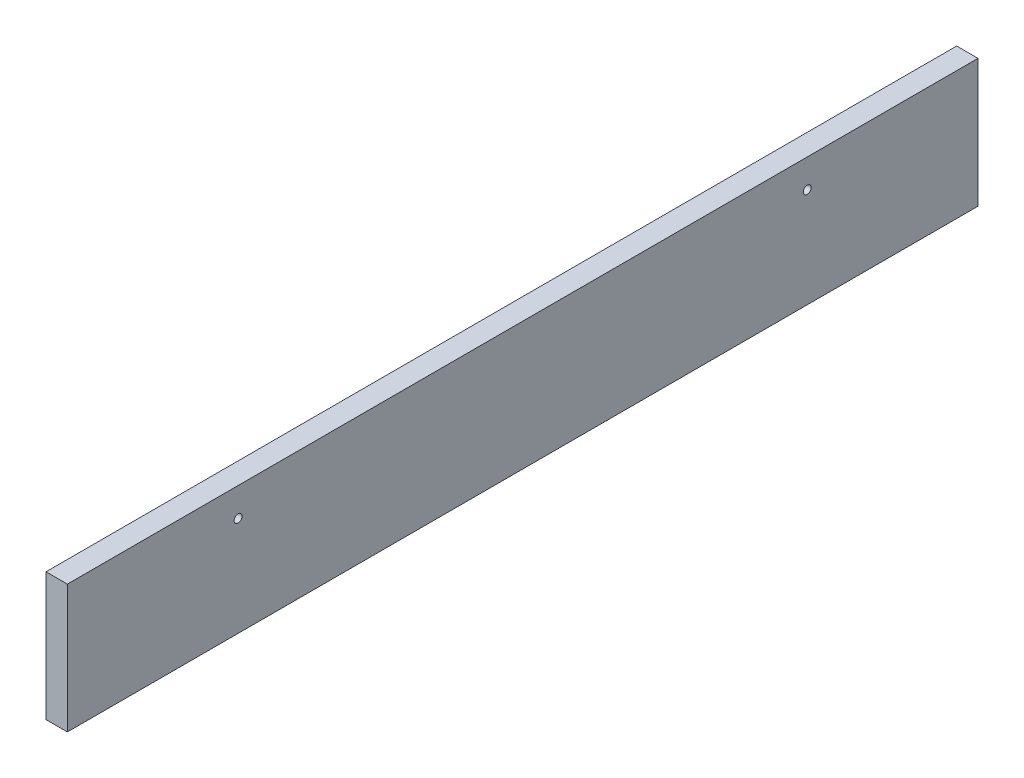
ISO-10303-21;
HEADER;
FILE_DESCRIPTION(('STEP AP214'),'2;1');
FILE_NAME('part.step','',(''),(''),'','','');
FILE_SCHEMA(('AUTOMOTIVE_DESIGN { 1 0 10303 214 1 1 1 1 }'));
ENDSEC;
DATA;
#1=APPLICATION_CONTEXT('core data for automotive mechanical design processes');
#2=APPLICATION_PROTOCOL_DEFINITION('international standard','automotive_design',2000,#1);
#3=PRODUCT_CONTEXT('',#1,'mechanical');
#4=PRODUCT('Part','Part','',(#3));
#5=PRODUCT_RELATED_PRODUCT_CATEGORY('part','',(#4));
#6=PRODUCT_DEFINITION_FORMATION('','',#4);
#7=PRODUCT_DEFINITION_CONTEXT('part definition',#1,'design');
#8=PRODUCT_DEFINITION('design','',#6,#7);
#9=PRODUCT_DEFINITION_SHAPE('','',#8);
#10=(LENGTH_UNIT() NAMED_UNIT(*) SI_UNIT(.MILLI.,.METRE.));
#11=(NAMED_UNIT(*) PLANE_ANGLE_UNIT() SI_UNIT($,.RADIAN.));
#12=(NAMED_UNIT(*) SI_UNIT($,.STERADIAN.) SOLID_ANGLE_UNIT());
#13=UNCERTAINTY_MEASURE_WITH_UNIT(LENGTH_MEASURE(1.E-05),#10,'distance_accuracy_value','');
#14=(GEOMETRIC_REPRESENTATION_CONTEXT(3) GLOBAL_UNCERTAINTY_ASSIGNED_CONTEXT((#13)) GLOBAL_UNIT_ASSIGNED_CONTEXT((#10,
#11,#12)) REPRESENTATION_CONTEXT('',''));
#15=CARTESIAN_POINT('',(0.,0.,0.));
#16=DIRECTION('',(0.,0.,1.));
#17=DIRECTION('',(1.,0.,0.));
#18=AXIS2_PLACEMENT_3D('',#15,#16,#17);
#19=CARTESIAN_POINT('',(-6.32852615853657,7.72454268292683,812.8));
#20=DIRECTION('',(1.,0.,0.));
#21=DIRECTION('',(0.,1.,0.));
#22=AXIS2_PLACEMENT_3D('',#19,#20,#21);
#23=PLANE('',#22);
#24=CARTESIAN_POINT('',(-6.32852615853657,-17.6754573170732,152.4));
#25=DIRECTION('',(-1.,0.,0.));
#26=DIRECTION('',(0.,-1.,0.));
#27=AXIS2_PLACEMENT_3D('',#24,#25,#26);
#28=CIRCLE('',#27,3.55600000000001);
#29=CARTESIAN_POINT('',(-6.32852615853657,-21.2314573170732,152.4));
#30=VERTEX_POINT('',#29);
#31=EDGE_CURVE('E140',#30,#30,#28,.T.);
#32=ORIENTED_EDGE('',*,*,#31,.F.);
#33=EDGE_LOOP('',(#32));
#34=FACE_BOUND('',#33,.T.);
#35=CARTESIAN_POINT('',(-6.32852615853657,-17.6754573170732,660.4));
#36=DIRECTION('',(-1.,0.,0.));
#37=DIRECTION('',(0.,-1.,0.));
#38=AXIS2_PLACEMENT_3D('',#35,#36,#37);
#39=CIRCLE('',#38,3.55599999999996);
#40=CARTESIAN_POINT('',(-6.32852615853657,-21.2314573170731,660.4));
#41=VERTEX_POINT('',#40);
#42=EDGE_CURVE('E132',#41,#41,#39,.T.);
#43=ORIENTED_EDGE('',*,*,#42,.F.);
#44=EDGE_LOOP('',(#43));
#45=FACE_BOUND('',#44,.T.);
#46=DIRECTION('',(0.,-1.,0.));
#47=VECTOR('',#46,1.);
#48=CARTESIAN_POINT('',(-6.32852615853657,7.72454268292683,0.));
#49=LINE('',#48,#47);
#50=CARTESIAN_POINT('',(-6.32852615853657,7.72454268292683,0.));
#51=VERTEX_POINT('',#50);
#52=CARTESIAN_POINT('',(-6.32852615853656,-106.575457317073,0.));
#53=VERTEX_POINT('',#52);
#54=EDGE_CURVE('E111',#51,#53,#49,.T.);
#55=ORIENTED_EDGE('',*,*,#54,.T.);
#56=DIRECTION('',(0.,0.,-1.));
#57=VECTOR('',#56,1.);
#58=CARTESIAN_POINT('',(-6.32852615853656,-106.575457317073,812.8));
#59=LINE('',#58,#57);
#60=CARTESIAN_POINT('',(-6.32852615853656,-106.575457317073,812.8));
#61=VERTEX_POINT('',#60);
#62=EDGE_CURVE('E11',#61,#53,#59,.T.);
#63=ORIENTED_EDGE('',*,*,#62,.F.);
#64=DIRECTION('',(0.,-1.,0.));
#65=VECTOR('',#64,1.);
#66=CARTESIAN_POINT('',(-6.32852615853657,7.72454268292683,812.8));
#67=LINE('',#66,#65);
#68=CARTESIAN_POINT('',(-6.32852615853657,7.72454268292683,812.8));
#69=VERTEX_POINT('',#68);
#70=EDGE_CURVE('E95',#69,#61,#67,.T.);
#71=ORIENTED_EDGE('',*,*,#70,.F.);
#72=DIRECTION('',(0.,0.,-1.));
#73=VECTOR('',#72,1.);
#74=CARTESIAN_POINT('',(-6.32852615853657,7.72454268292683,812.8));
#75=LINE('',#74,#73);
#76=EDGE_CURVE('E107',#69,#51,#75,.T.);
#77=ORIENTED_EDGE('',*,*,#76,.T.);
#78=EDGE_LOOP('',(#55,#63,#71,#77));
#79=FACE_BOUND('',#78,.T.);
#80=ADVANCED_FACE('F43',(#34,#45,#79),#23,.F.);
#81=CARTESIAN_POINT('',(-6.32852615853656,-106.575457317073,812.8));
#82=DIRECTION('',(0.,1.,0.));
#83=DIRECTION('',(0.,0.,1.));
#84=AXIS2_PLACEMENT_3D('',#81,#82,#83);
#85=PLANE('',#84);
#86=DIRECTION('',(1.,0.,0.));
#87=VECTOR('',#86,1.);
#88=CARTESIAN_POINT('',(-6.32852615853656,-106.575457317073,0.));
#89=LINE('',#88,#87);
#90=CARTESIAN_POINT('',(12.7214738414634,-106.575457317073,0.));
#91=VERTEX_POINT('',#90);
#92=EDGE_CURVE('E100',#53,#91,#89,.T.);
#93=ORIENTED_EDGE('',*,*,#92,.T.);
#94=DIRECTION('',(0.,0.,-1.));
#95=VECTOR('',#94,1.);
#96=CARTESIAN_POINT('',(12.7214738414634,-106.575457317073,812.8));
#97=LINE('',#96,#95);
#98=CARTESIAN_POINT('',(12.7214738414634,-106.575457317073,812.8));
#99=VERTEX_POINT('',#98);
#100=EDGE_CURVE('E52',#99,#91,#97,.T.);
#101=ORIENTED_EDGE('',*,*,#100,.F.);
#102=DIRECTION('',(1.,0.,0.));
#103=VECTOR('',#102,1.);
#104=CARTESIAN_POINT('',(-6.32852615853656,-106.575457317073,812.8));
#105=LINE('',#104,#103);
#106=EDGE_CURVE('E90',#61,#99,#105,.T.);
#107=ORIENTED_EDGE('',*,*,#106,.F.);
#108=ORIENTED_EDGE('',*,*,#62,.T.);
#109=EDGE_LOOP('',(#93,#101,#107,#108));
#110=FACE_BOUND('',#109,.T.);
#111=ADVANCED_FACE('F99',(#110),#85,.F.);
#112=CARTESIAN_POINT('',(12.7214738414634,7.72454268292683,812.8));
#113=DIRECTION('',(-1.,0.,0.));
#114=DIRECTION('',(0.,-1.,0.));
#115=AXIS2_PLACEMENT_3D('',#112,#113,#114);
#116=PLANE('',#115);
#117=CARTESIAN_POINT('',(12.7214738414635,-17.6754573170732,152.4));
#118=DIRECTION('',(-1.,0.,0.));
#119=DIRECTION('',(0.,-1.,0.));
#120=AXIS2_PLACEMENT_3D('',#117,#118,#119);
#121=CIRCLE('',#120,3.55600000000001);
#122=CARTESIAN_POINT('',(12.7214738414635,-21.2314573170732,152.4));
#123=VERTEX_POINT('',#122);
#124=EDGE_CURVE('E136',#123,#123,#121,.T.);
#125=ORIENTED_EDGE('',*,*,#124,.T.);
#126=EDGE_LOOP('',(#125));
#127=FACE_BOUND('',#126,.T.);
#128=CARTESIAN_POINT('',(12.7214738414634,-17.6754573170732,660.4));
#129=DIRECTION('',(-1.,0.,0.));
#130=DIRECTION('',(0.,-1.,0.));
#131=AXIS2_PLACEMENT_3D('',#128,#129,#130);
#132=CIRCLE('',#131,3.55599999999996);
#133=CARTESIAN_POINT('',(12.7214738414634,-21.2314573170731,660.4));
#134=VERTEX_POINT('',#133);
#135=EDGE_CURVE('E115',#134,#134,#132,.T.);
#136=ORIENTED_EDGE('',*,*,#135,.T.);
#137=EDGE_LOOP('',(#136));
#138=FACE_BOUND('',#137,.T.);
#139=DIRECTION('',(0.,1.,0.));
#140=VECTOR('',#139,1.);
#141=CARTESIAN_POINT('',(12.7214738414634,7.72454268292683,0.));
#142=LINE('',#141,#140);
#143=CARTESIAN_POINT('',(12.7214738414634,7.72454268292683,0.));
#144=VERTEX_POINT('',#143);
#145=EDGE_CURVE('E77',#91,#144,#142,.T.);
#146=ORIENTED_EDGE('',*,*,#145,.T.);
#147=DIRECTION('',(0.,0.,-1.));
#148=VECTOR('',#147,1.);
#149=CARTESIAN_POINT('',(12.7214738414634,7.72454268292683,812.8));
#150=LINE('',#149,#148);
#151=CARTESIAN_POINT('',(12.7214738414634,7.72454268292683,812.8));
#152=VERTEX_POINT('',#151);
#153=EDGE_CURVE('E102',#152,#144,#150,.T.);
#154=ORIENTED_EDGE('',*,*,#153,.F.);
#155=DIRECTION('',(0.,1.,0.));
#156=VECTOR('',#155,1.);
#157=CARTESIAN_POINT('',(12.7214738414634,7.72454268292683,812.8));
#158=LINE('',#157,#156);
#159=EDGE_CURVE('E93',#99,#152,#158,.T.);
#160=ORIENTED_EDGE('',*,*,#159,.F.);
#161=ORIENTED_EDGE('',*,*,#100,.T.);
#162=EDGE_LOOP('',(#146,#154,#160,#161));
#163=FACE_BOUND('',#162,.T.);
#164=ADVANCED_FACE('F103',(#127,#138,#163),#116,.F.);
#165=CARTESIAN_POINT('',(-6.32852615853657,7.72454268292683,812.8));
#166=DIRECTION('',(0.,-1.,0.));
#167=DIRECTION('',(0.,0.,-1.));
#168=AXIS2_PLACEMENT_3D('',#165,#166,#167);
#169=PLANE('',#168);
#170=DIRECTION('',(-1.,0.,0.));
#171=VECTOR('',#170,1.);
#172=CARTESIAN_POINT('',(-6.32852615853657,7.72454268292683,0.));
#173=LINE('',#172,#171);
#174=EDGE_CURVE('E83',#144,#51,#173,.T.);
#175=ORIENTED_EDGE('',*,*,#174,.T.);
#176=ORIENTED_EDGE('',*,*,#76,.F.);
#177=DIRECTION('',(-1.,0.,0.));
#178=VECTOR('',#177,1.);
#179=CARTESIAN_POINT('',(-6.32852615853657,7.72454268292683,812.8));
#180=LINE('',#179,#178);
#181=EDGE_CURVE('E60',#152,#69,#180,.T.);
#182=ORIENTED_EDGE('',*,*,#181,.F.);
#183=ORIENTED_EDGE('',*,*,#153,.T.);
#184=EDGE_LOOP('',(#175,#176,#182,#183));
#185=FACE_BOUND('',#184,.T.);
#186=ADVANCED_FACE('F125',(#185),#169,.F.);
#187=CARTESIAN_POINT('',(0.,0.,812.8));
#188=DIRECTION('',(0.,0.,1.));
#189=DIRECTION('',(1.,0.,0.));
#190=AXIS2_PLACEMENT_3D('',#187,#188,#189);
#191=PLANE('',#190);
#192=ORIENTED_EDGE('',*,*,#70,.T.);
#193=ORIENTED_EDGE('',*,*,#106,.T.);
#194=ORIENTED_EDGE('',*,*,#159,.T.);
#195=ORIENTED_EDGE('',*,*,#181,.T.);
#196=EDGE_LOOP('',(#192,#193,#194,#195));
#197=FACE_BOUND('',#196,.T.);
#198=ADVANCED_FACE('F91',(#197),#191,.T.);
#199=CARTESIAN_POINT('',(0.,0.,0.));
#200=DIRECTION('',(0.,0.,1.));
#201=DIRECTION('',(1.,0.,0.));
#202=AXIS2_PLACEMENT_3D('',#199,#200,#201);
#203=PLANE('',#202);
#204=ORIENTED_EDGE('',*,*,#54,.F.);
#205=ORIENTED_EDGE('',*,*,#174,.F.);
#206=ORIENTED_EDGE('',*,*,#145,.F.);
#207=ORIENTED_EDGE('',*,*,#92,.F.);
#208=EDGE_LOOP('',(#204,#205,#206,#207));
#209=FACE_BOUND('',#208,.T.);
#210=ADVANCED_FACE('F128',(#209),#203,.F.);
#211=CARTESIAN_POINT('',(12.7214738414634,-17.6754573170732,660.4));
#212=DIRECTION('',(-1.,0.,0.));
#213=DIRECTION('',(0.,-1.,0.));
#214=AXIS2_PLACEMENT_3D('',#211,#212,#213);
#215=CYLINDRICAL_SURFACE('',#214,3.55599999999996);
#216=ORIENTED_EDGE('',*,*,#135,.F.);
#217=EDGE_LOOP('',(#216));
#218=FACE_BOUND('',#217,.T.);
#219=ORIENTED_EDGE('',*,*,#42,.T.);
#220=EDGE_LOOP('',(#219));
#221=FACE_BOUND('',#220,.T.);
#222=ADVANCED_FACE('F153',(#218,#221),#215,.F.);
#223=CARTESIAN_POINT('',(12.7214738414635,-17.6754573170732,152.4));
#224=DIRECTION('',(-1.,0.,0.));
#225=DIRECTION('',(0.,-1.,0.));
#226=AXIS2_PLACEMENT_3D('',#223,#224,#225);
#227=CYLINDRICAL_SURFACE('',#226,3.55600000000001);
#228=ORIENTED_EDGE('',*,*,#124,.F.);
#229=EDGE_LOOP('',(#228));
#230=FACE_BOUND('',#229,.T.);
#231=ORIENTED_EDGE('',*,*,#31,.T.);
#232=EDGE_LOOP('',(#231));
#233=FACE_BOUND('',#232,.T.);
#234=ADVANCED_FACE('F150',(#230,#233),#227,.F.);
#235=CLOSED_SHELL('',(#80,#111,#164,#186,#198,#210,#222,#234));
#236=MANIFOLD_SOLID_BREP('B2',#235);
#237=ADVANCED_BREP_SHAPE_REPRESENTATION('',(#18,#236),#14);
#238=SHAPE_DEFINITION_REPRESENTATION(#9,#237);
ENDSEC;
END-ISO-10303-21;
